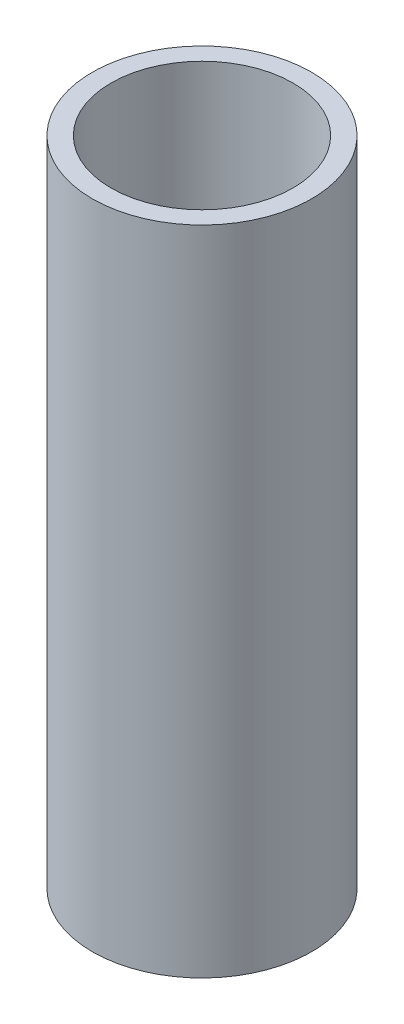
ISO-10303-21;
HEADER;
FILE_DESCRIPTION(('STEP AP214'),'2;1');
FILE_NAME('part.step','',(''),(''),'','','');
FILE_SCHEMA(('AUTOMOTIVE_DESIGN { 1 0 10303 214 1 1 1 1 }'));
ENDSEC;
DATA;
#1=APPLICATION_CONTEXT('core data for automotive mechanical design processes');
#2=APPLICATION_PROTOCOL_DEFINITION('international standard','automotive_design',2000,#1);
#3=PRODUCT_CONTEXT('',#1,'mechanical');
#4=PRODUCT('Part','Part','',(#3));
#5=PRODUCT_RELATED_PRODUCT_CATEGORY('part','',(#4));
#6=PRODUCT_DEFINITION_FORMATION('','',#4);
#7=PRODUCT_DEFINITION_CONTEXT('part definition',#1,'design');
#8=PRODUCT_DEFINITION('design','',#6,#7);
#9=PRODUCT_DEFINITION_SHAPE('','',#8);
#10=(LENGTH_UNIT() NAMED_UNIT(*) SI_UNIT(.MILLI.,.METRE.));
#11=(NAMED_UNIT(*) PLANE_ANGLE_UNIT() SI_UNIT($,.RADIAN.));
#12=(NAMED_UNIT(*) SI_UNIT($,.STERADIAN.) SOLID_ANGLE_UNIT());
#13=UNCERTAINTY_MEASURE_WITH_UNIT(LENGTH_MEASURE(1.E-05),#10,'distance_accuracy_value','');
#14=(GEOMETRIC_REPRESENTATION_CONTEXT(3) GLOBAL_UNCERTAINTY_ASSIGNED_CONTEXT((#13)) GLOBAL_UNIT_ASSIGNED_CONTEXT((#10,
#11,#12)) REPRESENTATION_CONTEXT('',''));
#15=CARTESIAN_POINT('',(0.,0.,0.));
#16=DIRECTION('',(0.,0.,1.));
#17=DIRECTION('',(1.,0.,0.));
#18=AXIS2_PLACEMENT_3D('',#15,#16,#17);
#19=CARTESIAN_POINT('',(0.,28.3972,0.));
#20=DIRECTION('',(0.,-1.,0.));
#21=DIRECTION('',(0.,0.,-1.));
#22=AXIS2_PLACEMENT_3D('',#19,#20,#21);
#23=CYLINDRICAL_SURFACE('',#22,4.7752);
#24=CARTESIAN_POINT('',(0.,28.3972,0.));
#25=DIRECTION('',(0.,1.,0.));
#26=DIRECTION('',(0.,0.,1.));
#27=AXIS2_PLACEMENT_3D('',#24,#25,#26);
#28=CIRCLE('',#27,4.7752);
#29=CARTESIAN_POINT('',(0.,28.3972,-4.7752));
#30=VERTEX_POINT('',#29);
#31=EDGE_CURVE('E10',#30,#30,#28,.T.);
#32=CARTESIAN_POINT('',(0.,0.,0.));
#33=DIRECTION('',(0.,1.,0.));
#34=DIRECTION('',(0.,0.,1.));
#35=AXIS2_PLACEMENT_3D('',#32,#33,#34);
#36=CIRCLE('',#35,4.7752);
#37=CARTESIAN_POINT('',(0.,0.,-4.7752));
#38=VERTEX_POINT('',#37);
#39=EDGE_CURVE('E34',#38,#38,#36,.T.);
#40=CARTESIAN_POINT('',(0.,28.3972,-4.7752));
#41=CARTESIAN_POINT('',(0.,28.1013958333333,-4.7752));
#42=CARTESIAN_POINT('',(0.,27.8055916666667,-4.7752));
#43=CARTESIAN_POINT('',(0.,27.2139833333333,-4.7752));
#44=CARTESIAN_POINT('',(0.,26.9181791666667,-4.7752));
#45=CARTESIAN_POINT('',(0.,26.3265708333333,-4.7752));
#46=CARTESIAN_POINT('',(0.,26.0307666666667,-4.7752));
#47=CARTESIAN_POINT('',(0.,25.4391583333333,-4.7752));
#48=CARTESIAN_POINT('',(0.,25.1433541666667,-4.7752));
#49=CARTESIAN_POINT('',(0.,24.5517458333333,-4.7752));
#50=CARTESIAN_POINT('',(0.,24.2559416666667,-4.7752));
#51=CARTESIAN_POINT('',(0.,23.6643333333333,-4.7752));
#52=CARTESIAN_POINT('',(0.,23.3685291666667,-4.7752));
#53=CARTESIAN_POINT('',(0.,22.7769208333333,-4.7752));
#54=CARTESIAN_POINT('',(0.,22.4811166666667,-4.7752));
#55=CARTESIAN_POINT('',(0.,21.8895083333333,-4.7752));
#56=CARTESIAN_POINT('',(0.,21.5937041666667,-4.7752));
#57=CARTESIAN_POINT('',(0.,21.0020958333333,-4.7752));
#58=CARTESIAN_POINT('',(0.,20.7062916666667,-4.7752));
#59=CARTESIAN_POINT('',(0.,20.1146833333333,-4.7752));
#60=CARTESIAN_POINT('',(0.,19.8188791666667,-4.7752));
#61=CARTESIAN_POINT('',(0.,19.2272708333333,-4.7752));
#62=CARTESIAN_POINT('',(0.,18.9314666666667,-4.7752));
#63=CARTESIAN_POINT('',(0.,18.3398583333333,-4.7752));
#64=CARTESIAN_POINT('',(0.,18.0440541666667,-4.7752));
#65=CARTESIAN_POINT('',(0.,17.4524458333333,-4.7752));
#66=CARTESIAN_POINT('',(0.,17.1566416666667,-4.7752));
#67=CARTESIAN_POINT('',(0.,16.5650333333333,-4.7752));
#68=CARTESIAN_POINT('',(0.,16.2692291666667,-4.7752));
#69=CARTESIAN_POINT('',(0.,15.6776208333333,-4.7752));
#70=CARTESIAN_POINT('',(0.,15.3818166666667,-4.7752));
#71=CARTESIAN_POINT('',(0.,14.7902083333333,-4.7752));
#72=CARTESIAN_POINT('',(0.,14.4944041666667,-4.7752));
#73=CARTESIAN_POINT('',(0.,13.9027958333333,-4.7752));
#74=CARTESIAN_POINT('',(0.,13.6069916666667,-4.7752));
#75=CARTESIAN_POINT('',(0.,13.0153833333333,-4.7752));
#76=CARTESIAN_POINT('',(0.,12.7195791666667,-4.7752));
#77=CARTESIAN_POINT('',(0.,12.1279708333333,-4.7752));
#78=CARTESIAN_POINT('',(0.,11.8321666666667,-4.7752));
#79=CARTESIAN_POINT('',(0.,11.2405583333333,-4.7752));
#80=CARTESIAN_POINT('',(0.,10.9447541666667,-4.7752));
#81=CARTESIAN_POINT('',(0.,10.3531458333333,-4.7752));
#82=CARTESIAN_POINT('',(0.,10.0573416666667,-4.7752));
#83=CARTESIAN_POINT('',(0.,9.46573333333333,-4.7752));
#84=CARTESIAN_POINT('',(0.,9.16992916666667,-4.7752));
#85=CARTESIAN_POINT('',(0.,8.57832083333333,-4.7752));
#86=CARTESIAN_POINT('',(0.,8.28251666666667,-4.7752));
#87=CARTESIAN_POINT('',(0.,7.69090833333333,-4.7752));
#88=CARTESIAN_POINT('',(0.,7.39510416666667,-4.7752));
#89=CARTESIAN_POINT('',(0.,6.80349583333334,-4.7752));
#90=CARTESIAN_POINT('',(0.,6.50769166666667,-4.7752));
#91=CARTESIAN_POINT('',(0.,5.91608333333334,-4.7752));
#92=CARTESIAN_POINT('',(0.,5.62027916666667,-4.7752));
#93=CARTESIAN_POINT('',(0.,5.02867083333334,-4.7752));
#94=CARTESIAN_POINT('',(0.,4.73286666666667,-4.7752));
#95=CARTESIAN_POINT('',(0.,4.14125833333333,-4.7752));
#96=CARTESIAN_POINT('',(0.,3.84545416666667,-4.7752));
#97=CARTESIAN_POINT('',(0.,3.25384583333333,-4.7752));
#98=CARTESIAN_POINT('',(0.,2.95804166666667,-4.7752));
#99=CARTESIAN_POINT('',(0.,2.36643333333333,-4.7752));
#100=CARTESIAN_POINT('',(0.,2.07062916666667,-4.7752));
#101=CARTESIAN_POINT('',(0.,1.47902083333333,-4.7752));
#102=CARTESIAN_POINT('',(0.,1.18321666666667,-4.7752));
#103=CARTESIAN_POINT('',(0.,0.591608333333334,-4.7752));
#104=CARTESIAN_POINT('',(0.,0.295804166666667,-4.7752));
#105=CARTESIAN_POINT('',(0.,0.,-4.7752));
#106=B_SPLINE_CURVE_WITH_KNOTS('',3,(#40,#41,#42,#43,#44,#45,#46,#47,#48,#49,#50,#51,#52,#53,
#54,#55,#56,#57,#58,#59,#60,#61,#62,#63,#64,#65,#66,#67,#68,#69,#70,#71,#72,#73,#74,#75,#76,#77,
#78,#79,#80,#81,#82,#83,#84,#85,#86,#87,#88,#89,#90,#91,#92,#93,#94,#95,#96,#97,#98,#99,#100,
#101,#102,#103,#104,#105),.UNSPECIFIED.,.F.,.F.,(4,2,2,2,2,2,2,2,2,2,2,2,2,2,2,2,2,2,2,2,2,2,2,
2,2,2,2,2,2,2,2,2,4),(0.,0.8874125,1.774825,2.6622375,3.54965,4.4370625,5.324475,6.2118875,
7.0993,7.9867125,8.874125,9.7615375,10.64895,11.5363625,12.423775,13.3111875,14.1986,15.0860125,
15.973425,16.8608375,17.74825,18.6356625,19.523075,20.4104875,21.2979,22.1853125,23.072725,
23.9601375,24.84755,25.7349625,26.622375,27.5097875,28.3972),.UNSPECIFIED.);
#107=EDGE_CURVE('BSEAM31',#30,#38,#106,.T.);
#108=ORIENTED_EDGE('',*,*,#31,.F.);
#109=ORIENTED_EDGE('',*,*,#39,.T.);
#110=ORIENTED_EDGE('',*,*,#107,.T.);
#111=ORIENTED_EDGE('',*,*,#107,.F.);
#112=EDGE_LOOP('',(#108,#110,#109,#111));
#113=FACE_BOUND('',#112,.T.);
#114=ADVANCED_FACE('F31',(#113),#23,.T.);
#115=CARTESIAN_POINT('',(0.,28.3972,0.));
#116=DIRECTION('',(0.,1.,0.));
#117=DIRECTION('',(0.,0.,1.));
#118=AXIS2_PLACEMENT_3D('',#115,#116,#117);
#119=PLANE('',#118);
#120=CARTESIAN_POINT('',(0.,28.3972,0.));
#121=DIRECTION('',(0.,1.,0.));
#122=DIRECTION('',(0.,0.,1.));
#123=AXIS2_PLACEMENT_3D('',#120,#121,#122);
#124=CIRCLE('',#123,3.9624);
#125=CARTESIAN_POINT('',(0.,28.3972,3.9624));
#126=VERTEX_POINT('',#125);
#127=EDGE_CURVE('E43',#126,#126,#124,.T.);
#128=ORIENTED_EDGE('',*,*,#127,.F.);
#129=EDGE_LOOP('',(#128));
#130=FACE_BOUND('',#129,.T.);
#131=ORIENTED_EDGE('',*,*,#31,.T.);
#132=EDGE_LOOP('',(#131));
#133=FACE_BOUND('',#132,.T.);
#134=ADVANCED_FACE('F58',(#130,#133),#119,.T.);
#135=CARTESIAN_POINT('',(0.,0.,0.));
#136=DIRECTION('',(0.,1.,0.));
#137=DIRECTION('',(0.,0.,1.));
#138=AXIS2_PLACEMENT_3D('',#135,#136,#137);
#139=PLANE('',#138);
#140=CARTESIAN_POINT('',(0.,0.,0.));
#141=DIRECTION('',(0.,1.,0.));
#142=DIRECTION('',(0.,0.,1.));
#143=AXIS2_PLACEMENT_3D('',#140,#141,#142);
#144=CIRCLE('',#143,3.9624);
#145=CARTESIAN_POINT('',(0.,0.,3.9624));
#146=VERTEX_POINT('',#145);
#147=EDGE_CURVE('E41',#146,#146,#144,.T.);
#148=ORIENTED_EDGE('',*,*,#147,.T.);
#149=EDGE_LOOP('',(#148));
#150=FACE_BOUND('',#149,.T.);
#151=ORIENTED_EDGE('',*,*,#39,.F.);
#152=EDGE_LOOP('',(#151));
#153=FACE_BOUND('',#152,.T.);
#154=ADVANCED_FACE('F49',(#150,#153),#139,.F.);
#155=CARTESIAN_POINT('',(0.,0.,0.));
#156=DIRECTION('',(0.,1.,0.));
#157=DIRECTION('',(0.,0.,1.));
#158=AXIS2_PLACEMENT_3D('',#155,#156,#157);
#159=CYLINDRICAL_SURFACE('',#158,3.9624);
#160=CARTESIAN_POINT('',(0.,0.,3.9624));
#161=CARTESIAN_POINT('',(0.,0.295804166666666,3.9624));
#162=CARTESIAN_POINT('',(0.,0.591608333333333,3.9624));
#163=CARTESIAN_POINT('',(0.,1.18321666666667,3.9624));
#164=CARTESIAN_POINT('',(0.,1.47902083333333,3.9624));
#165=CARTESIAN_POINT('',(0.,2.07062916666667,3.9624));
#166=CARTESIAN_POINT('',(0.,2.36643333333333,3.9624));
#167=CARTESIAN_POINT('',(0.,2.95804166666667,3.9624));
#168=CARTESIAN_POINT('',(0.,3.25384583333333,3.9624));
#169=CARTESIAN_POINT('',(0.,3.84545416666667,3.9624));
#170=CARTESIAN_POINT('',(0.,4.14125833333333,3.9624));
#171=CARTESIAN_POINT('',(0.,4.73286666666667,3.9624));
#172=CARTESIAN_POINT('',(0.,5.02867083333333,3.9624));
#173=CARTESIAN_POINT('',(0.,5.62027916666667,3.9624));
#174=CARTESIAN_POINT('',(0.,5.91608333333333,3.9624));
#175=CARTESIAN_POINT('',(0.,6.50769166666667,3.9624));
#176=CARTESIAN_POINT('',(0.,6.80349583333333,3.9624));
#177=CARTESIAN_POINT('',(0.,7.39510416666667,3.9624));
#178=CARTESIAN_POINT('',(0.,7.69090833333333,3.9624));
#179=CARTESIAN_POINT('',(0.,8.28251666666667,3.9624));
#180=CARTESIAN_POINT('',(0.,8.57832083333333,3.9624));
#181=CARTESIAN_POINT('',(0.,9.16992916666667,3.9624));
#182=CARTESIAN_POINT('',(0.,9.46573333333333,3.9624));
#183=CARTESIAN_POINT('',(0.,10.0573416666667,3.9624));
#184=CARTESIAN_POINT('',(0.,10.3531458333333,3.9624));
#185=CARTESIAN_POINT('',(0.,10.9447541666667,3.9624));
#186=CARTESIAN_POINT('',(0.,11.2405583333333,3.9624));
#187=CARTESIAN_POINT('',(0.,11.8321666666667,3.9624));
#188=CARTESIAN_POINT('',(0.,12.1279708333333,3.9624));
#189=CARTESIAN_POINT('',(0.,12.7195791666667,3.9624));
#190=CARTESIAN_POINT('',(0.,13.0153833333333,3.9624));
#191=CARTESIAN_POINT('',(0.,13.6069916666667,3.9624));
#192=CARTESIAN_POINT('',(0.,13.9027958333333,3.9624));
#193=CARTESIAN_POINT('',(0.,14.4944041666667,3.9624));
#194=CARTESIAN_POINT('',(0.,14.7902083333333,3.9624));
#195=CARTESIAN_POINT('',(0.,15.3818166666667,3.9624));
#196=CARTESIAN_POINT('',(0.,15.6776208333333,3.9624));
#197=CARTESIAN_POINT('',(0.,16.2692291666667,3.9624));
#198=CARTESIAN_POINT('',(0.,16.5650333333333,3.9624));
#199=CARTESIAN_POINT('',(0.,17.1566416666667,3.9624));
#200=CARTESIAN_POINT('',(0.,17.4524458333333,3.9624));
#201=CARTESIAN_POINT('',(0.,18.0440541666667,3.9624));
#202=CARTESIAN_POINT('',(0.,18.3398583333333,3.9624));
#203=CARTESIAN_POINT('',(0.,18.9314666666667,3.9624));
#204=CARTESIAN_POINT('',(0.,19.2272708333333,3.9624));
#205=CARTESIAN_POINT('',(0.,19.8188791666667,3.9624));
#206=CARTESIAN_POINT('',(0.,20.1146833333333,3.9624));
#207=CARTESIAN_POINT('',(0.,20.7062916666667,3.9624));
#208=CARTESIAN_POINT('',(0.,21.0020958333333,3.9624));
#209=CARTESIAN_POINT('',(0.,21.5937041666667,3.9624));
#210=CARTESIAN_POINT('',(0.,21.8895083333333,3.9624));
#211=CARTESIAN_POINT('',(0.,22.4811166666667,3.9624));
#212=CARTESIAN_POINT('',(0.,22.7769208333333,3.9624));
#213=CARTESIAN_POINT('',(0.,23.3685291666667,3.9624));
#214=CARTESIAN_POINT('',(0.,23.6643333333333,3.9624));
#215=CARTESIAN_POINT('',(0.,24.2559416666667,3.9624));
#216=CARTESIAN_POINT('',(0.,24.5517458333333,3.9624));
#217=CARTESIAN_POINT('',(0.,25.1433541666667,3.9624));
#218=CARTESIAN_POINT('',(0.,25.4391583333333,3.9624));
#219=CARTESIAN_POINT('',(0.,26.0307666666667,3.9624));
#220=CARTESIAN_POINT('',(0.,26.3265708333333,3.9624));
#221=CARTESIAN_POINT('',(0.,26.9181791666667,3.9624));
#222=CARTESIAN_POINT('',(0.,27.2139833333333,3.9624));
#223=CARTESIAN_POINT('',(0.,27.8055916666667,3.9624));
#224=CARTESIAN_POINT('',(0.,28.1013958333333,3.9624));
#225=CARTESIAN_POINT('',(0.,28.3972,3.9624));
#226=B_SPLINE_CURVE_WITH_KNOTS('',3,(#160,#161,#162,#163,#164,#165,#166,#167,#168,#169,#170,
#171,#172,#173,#174,#175,#176,#177,#178,#179,#180,#181,#182,#183,#184,#185,#186,#187,#188,#189,
#190,#191,#192,#193,#194,#195,#196,#197,#198,#199,#200,#201,#202,#203,#204,#205,#206,#207,#208,
#209,#210,#211,#212,#213,#214,#215,#216,#217,#218,#219,#220,#221,#222,#223,#224,#225),
.UNSPECIFIED.,.F.,.F.,(4,2,2,2,2,2,2,2,2,2,2,2,2,2,2,2,2,2,2,2,2,2,2,2,2,2,2,2,2,2,2,2,4),(0.,
0.8874125,1.774825,2.6622375,3.54965,4.4370625,5.324475,6.2118875,7.0993,7.9867125,8.874125,
9.7615375,10.64895,11.5363625,12.423775,13.3111875,14.1986,15.0860125,15.973425,16.8608375,
17.74825,18.6356625,19.523075,20.4104875,21.2979,22.1853125,23.072725,23.9601375,24.84755,
25.7349625,26.622375,27.5097875,28.3972),.UNSPECIFIED.);
#227=EDGE_CURVE('BSEAM52',#146,#126,#226,.T.);
#228=ORIENTED_EDGE('',*,*,#147,.F.);
#229=ORIENTED_EDGE('',*,*,#127,.T.);
#230=ORIENTED_EDGE('',*,*,#227,.T.);
#231=ORIENTED_EDGE('',*,*,#227,.F.);
#232=EDGE_LOOP('',(#228,#230,#229,#231));
#233=FACE_BOUND('',#232,.T.);
#234=ADVANCED_FACE('F52',(#233),#159,.F.);
#235=CLOSED_SHELL('',(#114,#134,#154,#234));
#236=MANIFOLD_SOLID_BREP('B2',#235);
#237=ADVANCED_BREP_SHAPE_REPRESENTATION('',(#18,#236),#14);
#238=SHAPE_DEFINITION_REPRESENTATION(#9,#237);
ENDSEC;
END-ISO-10303-21;
